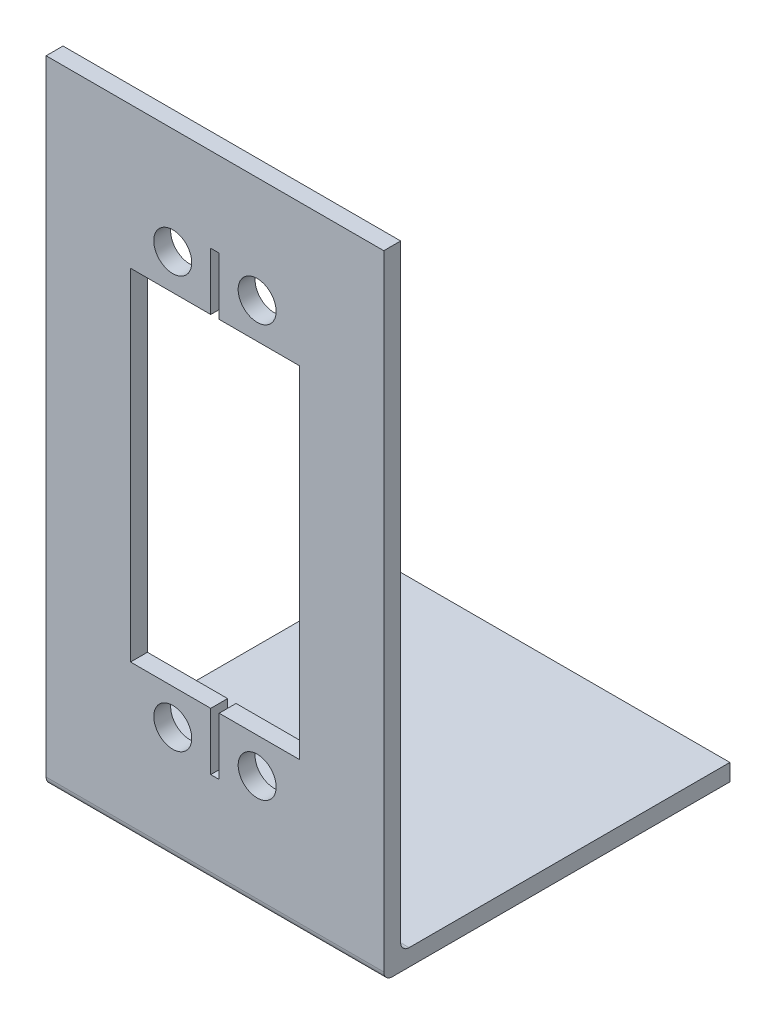
ISO-10303-21;
HEADER;
FILE_DESCRIPTION(('STEP AP214'),'2;1');
FILE_NAME('part.step','',(''),(''),'','','');
FILE_SCHEMA(('AUTOMOTIVE_DESIGN { 1 0 10303 214 1 1 1 1 }'));
ENDSEC;
DATA;
#1=APPLICATION_CONTEXT('core data for automotive mechanical design processes');
#2=APPLICATION_PROTOCOL_DEFINITION('international standard','automotive_design',2000,#1);
#3=PRODUCT_CONTEXT('',#1,'mechanical');
#4=PRODUCT('Part','Part','',(#3));
#5=PRODUCT_RELATED_PRODUCT_CATEGORY('part','',(#4));
#6=PRODUCT_DEFINITION_FORMATION('','',#4);
#7=PRODUCT_DEFINITION_CONTEXT('part definition',#1,'design');
#8=PRODUCT_DEFINITION('design','',#6,#7);
#9=PRODUCT_DEFINITION_SHAPE('','',#8);
#10=(LENGTH_UNIT() NAMED_UNIT(*) SI_UNIT(.MILLI.,.METRE.));
#11=(NAMED_UNIT(*) PLANE_ANGLE_UNIT() SI_UNIT($,.RADIAN.));
#12=(NAMED_UNIT(*) SI_UNIT($,.STERADIAN.) SOLID_ANGLE_UNIT());
#13=UNCERTAINTY_MEASURE_WITH_UNIT(LENGTH_MEASURE(1.E-05),#10,'distance_accuracy_value','');
#14=(GEOMETRIC_REPRESENTATION_CONTEXT(3) GLOBAL_UNCERTAINTY_ASSIGNED_CONTEXT((#13)) GLOBAL_UNIT_ASSIGNED_CONTEXT((#10,
#11,#12)) REPRESENTATION_CONTEXT('',''));
#15=CARTESIAN_POINT('',(0.,0.,0.));
#16=DIRECTION('',(0.,0.,1.));
#17=DIRECTION('',(1.,0.,0.));
#18=AXIS2_PLACEMENT_3D('',#15,#16,#17);
#19=CARTESIAN_POINT('',(0.,0.,-1.));
#20=DIRECTION('',(0.,0.,1.));
#21=DIRECTION('',(1.,0.,0.));
#22=AXIS2_PLACEMENT_3D('',#19,#20,#21);
#23=PLANE('',#22);
#24=CARTESIAN_POINT('',(25.,62.4,-1.));
#25=DIRECTION('',(0.,0.,1.));
#26=DIRECTION('',(1.,0.,0.));
#27=AXIS2_PLACEMENT_3D('',#24,#25,#26);
#28=CIRCLE('',#27,2.25000000000002);
#29=CARTESIAN_POINT('',(27.25,62.4,-1.));
#30=VERTEX_POINT('',#29);
#31=EDGE_CURVE('E441',#30,#30,#28,.T.);
#32=ORIENTED_EDGE('',*,*,#31,.T.);
#33=EDGE_LOOP('',(#32));
#34=FACE_BOUND('',#33,.T.);
#35=CARTESIAN_POINT('',(15.,13.6,-1.));
#36=DIRECTION('',(0.,0.,1.));
#37=DIRECTION('',(1.,0.,0.));
#38=AXIS2_PLACEMENT_3D('',#35,#36,#37);
#39=CIRCLE('',#38,2.25);
#40=CARTESIAN_POINT('',(17.25,13.6,-1.));
#41=VERTEX_POINT('',#40);
#42=EDGE_CURVE('E438',#41,#41,#39,.T.);
#43=ORIENTED_EDGE('',*,*,#42,.T.);
#44=EDGE_LOOP('',(#43));
#45=FACE_BOUND('',#44,.T.);
#46=CARTESIAN_POINT('',(25.,13.6,-1.));
#47=DIRECTION('',(0.,0.,1.));
#48=DIRECTION('',(1.,0.,0.));
#49=AXIS2_PLACEMENT_3D('',#46,#47,#48);
#50=CIRCLE('',#49,2.25);
#51=CARTESIAN_POINT('',(27.25,13.6,-1.));
#52=VERTEX_POINT('',#51);
#53=EDGE_CURVE('E435',#52,#52,#50,.T.);
#54=ORIENTED_EDGE('',*,*,#53,.T.);
#55=EDGE_LOOP('',(#54));
#56=FACE_BOUND('',#55,.T.);
#57=DIRECTION('',(0.,1.,0.));
#58=VECTOR('',#57,1.);
#59=CARTESIAN_POINT('',(40.,0.,-1.));
#60=LINE('',#59,#58);
#61=CARTESIAN_POINT('',(40.,3.,-1.));
#62=VERTEX_POINT('',#61);
#63=CARTESIAN_POINT('',(40.,75.,-1.));
#64=VERTEX_POINT('',#63);
#65=EDGE_CURVE('E457',#62,#64,#60,.T.);
#66=ORIENTED_EDGE('',*,*,#65,.F.);
#67=DIRECTION('',(-1.,0.,0.));
#68=VECTOR('',#67,1.);
#69=CARTESIAN_POINT('',(0.,3.,-1.));
#70=LINE('',#69,#68);
#71=CARTESIAN_POINT('',(0.,3.,-1.));
#72=VERTEX_POINT('',#71);
#73=EDGE_CURVE('E493',#62,#72,#70,.T.);
#74=ORIENTED_EDGE('',*,*,#73,.T.);
#75=DIRECTION('',(0.,1.,0.));
#76=VECTOR('',#75,1.);
#77=CARTESIAN_POINT('',(0.,0.,-1.));
#78=LINE('',#77,#76);
#79=CARTESIAN_POINT('',(0.,75.,-1.));
#80=VERTEX_POINT('',#79);
#81=EDGE_CURVE('E456',#72,#80,#78,.T.);
#82=ORIENTED_EDGE('',*,*,#81,.T.);
#83=DIRECTION('',(1.,0.,0.));
#84=VECTOR('',#83,1.);
#85=CARTESIAN_POINT('',(0.,75.,-1.));
#86=LINE('',#85,#84);
#87=EDGE_CURVE('E444',#80,#64,#86,.T.);
#88=ORIENTED_EDGE('',*,*,#87,.T.);
#89=EDGE_LOOP('',(#66,#74,#82,#88));
#90=FACE_BOUND('',#89,.T.);
#91=CARTESIAN_POINT('',(15.,62.4,-1.));
#92=DIRECTION('',(0.,0.,1.));
#93=DIRECTION('',(1.,0.,0.));
#94=AXIS2_PLACEMENT_3D('',#91,#92,#93);
#95=CIRCLE('',#94,2.25);
#96=CARTESIAN_POINT('',(17.25,62.4,-1.));
#97=VERTEX_POINT('',#96);
#98=EDGE_CURVE('E404',#97,#97,#95,.T.);
#99=ORIENTED_EDGE('',*,*,#98,.T.);
#100=EDGE_LOOP('',(#99));
#101=FACE_BOUND('',#100,.T.);
#102=DIRECTION('',(-1.,0.,0.));
#103=VECTOR('',#102,1.);
#104=CARTESIAN_POINT('',(0.,11.,-1.));
#105=LINE('',#104,#103);
#106=CARTESIAN_POINT('',(20.5,11.,-1.));
#107=VERTEX_POINT('',#106);
#108=CARTESIAN_POINT('',(19.5,11.,-1.));
#109=VERTEX_POINT('',#108);
#110=EDGE_CURVE('E433',#107,#109,#105,.T.);
#111=ORIENTED_EDGE('',*,*,#110,.F.);
#112=DIRECTION('',(0.,-1.,0.));
#113=VECTOR('',#112,1.);
#114=CARTESIAN_POINT('',(20.5,0.,-1.));
#115=LINE('',#114,#113);
#116=CARTESIAN_POINT('',(20.5,17.8,-1.));
#117=VERTEX_POINT('',#116);
#118=EDGE_CURVE('E407',#117,#107,#115,.T.);
#119=ORIENTED_EDGE('',*,*,#118,.F.);
#120=DIRECTION('',(1.,0.,0.));
#121=VECTOR('',#120,1.);
#122=CARTESIAN_POINT('',(0.,17.8,-1.));
#123=LINE('',#122,#121);
#124=CARTESIAN_POINT('',(30.,17.8,-1.));
#125=VERTEX_POINT('',#124);
#126=EDGE_CURVE('E334',#117,#125,#123,.T.);
#127=ORIENTED_EDGE('',*,*,#126,.T.);
#128=DIRECTION('',(0.,-1.,0.));
#129=VECTOR('',#128,1.);
#130=CARTESIAN_POINT('',(30.,0.,-1.));
#131=LINE('',#130,#129);
#132=CARTESIAN_POINT('',(30.,58.2,-1.));
#133=VERTEX_POINT('',#132);
#134=EDGE_CURVE('E410',#133,#125,#131,.T.);
#135=ORIENTED_EDGE('',*,*,#134,.F.);
#136=DIRECTION('',(1.,0.,0.));
#137=VECTOR('',#136,1.);
#138=CARTESIAN_POINT('',(0.,58.2,-1.));
#139=LINE('',#138,#137);
#140=CARTESIAN_POINT('',(20.5,58.2,-1.));
#141=VERTEX_POINT('',#140);
#142=EDGE_CURVE('E412',#141,#133,#139,.T.);
#143=ORIENTED_EDGE('',*,*,#142,.F.);
#144=DIRECTION('',(0.,-1.,0.));
#145=VECTOR('',#144,1.);
#146=CARTESIAN_POINT('',(20.5,0.,-1.));
#147=LINE('',#146,#145);
#148=CARTESIAN_POINT('',(20.5,65.,-1.));
#149=VERTEX_POINT('',#148);
#150=EDGE_CURVE('E414',#149,#141,#147,.T.);
#151=ORIENTED_EDGE('',*,*,#150,.F.);
#152=DIRECTION('',(-1.,0.,0.));
#153=VECTOR('',#152,1.);
#154=CARTESIAN_POINT('',(0.,65.,-1.));
#155=LINE('',#154,#153);
#156=CARTESIAN_POINT('',(19.5,65.,-1.));
#157=VERTEX_POINT('',#156);
#158=EDGE_CURVE('E416',#149,#157,#155,.T.);
#159=ORIENTED_EDGE('',*,*,#158,.T.);
#160=DIRECTION('',(0.,-1.,0.));
#161=VECTOR('',#160,1.);
#162=CARTESIAN_POINT('',(19.5,0.,-1.));
#163=LINE('',#162,#161);
#164=CARTESIAN_POINT('',(19.5,58.2,-1.));
#165=VERTEX_POINT('',#164);
#166=EDGE_CURVE('E419',#157,#165,#163,.T.);
#167=ORIENTED_EDGE('',*,*,#166,.T.);
#168=DIRECTION('',(-1.,0.,0.));
#169=VECTOR('',#168,1.);
#170=CARTESIAN_POINT('',(0.,58.2,-1.));
#171=LINE('',#170,#169);
#172=CARTESIAN_POINT('',(10.,58.2,-1.));
#173=VERTEX_POINT('',#172);
#174=EDGE_CURVE('E422',#165,#173,#171,.T.);
#175=ORIENTED_EDGE('',*,*,#174,.T.);
#176=DIRECTION('',(0.,-1.,0.));
#177=VECTOR('',#176,1.);
#178=CARTESIAN_POINT('',(10.,0.,-1.));
#179=LINE('',#178,#177);
#180=CARTESIAN_POINT('',(10.,17.8,-1.));
#181=VERTEX_POINT('',#180);
#182=EDGE_CURVE('E425',#173,#181,#179,.T.);
#183=ORIENTED_EDGE('',*,*,#182,.T.);
#184=DIRECTION('',(-1.,0.,0.));
#185=VECTOR('',#184,1.);
#186=CARTESIAN_POINT('',(0.,17.8,-1.));
#187=LINE('',#186,#185);
#188=CARTESIAN_POINT('',(19.5,17.8,-1.));
#189=VERTEX_POINT('',#188);
#190=EDGE_CURVE('E428',#189,#181,#187,.T.);
#191=ORIENTED_EDGE('',*,*,#190,.F.);
#192=DIRECTION('',(0.,-1.,0.));
#193=VECTOR('',#192,1.);
#194=CARTESIAN_POINT('',(19.5,0.,-1.));
#195=LINE('',#194,#193);
#196=EDGE_CURVE('E430',#189,#109,#195,.T.);
#197=ORIENTED_EDGE('',*,*,#196,.T.);
#198=EDGE_LOOP('',(#111,#119,#127,#135,#143,#151,#159,#167,#175,#183,#191,#197));
#199=FACE_BOUND('',#198,.T.);
#200=ADVANCED_FACE('F192',(#34,#45,#56,#90,#101,#199),#23,.F.);
#201=CARTESIAN_POINT('',(0.,0.,1.));
#202=DIRECTION('',(0.,0.,1.));
#203=DIRECTION('',(1.,0.,0.));
#204=AXIS2_PLACEMENT_3D('',#201,#202,#203);
#205=PLANE('',#204);
#206=CARTESIAN_POINT('',(25.,62.4,1.));
#207=DIRECTION('',(0.,0.,1.));
#208=DIRECTION('',(1.,0.,0.));
#209=AXIS2_PLACEMENT_3D('',#206,#207,#208);
#210=CIRCLE('',#209,2.25000000000002);
#211=CARTESIAN_POINT('',(27.25,62.4,1.));
#212=VERTEX_POINT('',#211);
#213=EDGE_CURVE('E396',#212,#212,#210,.T.);
#214=ORIENTED_EDGE('',*,*,#213,.F.);
#215=EDGE_LOOP('',(#214));
#216=FACE_BOUND('',#215,.T.);
#217=CARTESIAN_POINT('',(15.,13.6,1.));
#218=DIRECTION('',(0.,0.,1.));
#219=DIRECTION('',(1.,0.,0.));
#220=AXIS2_PLACEMENT_3D('',#217,#218,#219);
#221=CIRCLE('',#220,2.25);
#222=CARTESIAN_POINT('',(17.25,13.6,1.));
#223=VERTEX_POINT('',#222);
#224=EDGE_CURVE('E377',#223,#223,#221,.T.);
#225=ORIENTED_EDGE('',*,*,#224,.F.);
#226=EDGE_LOOP('',(#225));
#227=FACE_BOUND('',#226,.T.);
#228=CARTESIAN_POINT('',(25.,13.6,1.));
#229=DIRECTION('',(0.,0.,1.));
#230=DIRECTION('',(1.,0.,0.));
#231=AXIS2_PLACEMENT_3D('',#228,#229,#230);
#232=CIRCLE('',#231,2.25);
#233=CARTESIAN_POINT('',(27.25,13.6,1.));
#234=VERTEX_POINT('',#233);
#235=EDGE_CURVE('E575',#234,#234,#232,.T.);
#236=ORIENTED_EDGE('',*,*,#235,.F.);
#237=EDGE_LOOP('',(#236));
#238=FACE_BOUND('',#237,.T.);
#239=CARTESIAN_POINT('',(15.,62.4,1.));
#240=DIRECTION('',(0.,0.,1.));
#241=DIRECTION('',(1.,0.,0.));
#242=AXIS2_PLACEMENT_3D('',#239,#240,#241);
#243=CIRCLE('',#242,2.25);
#244=CARTESIAN_POINT('',(17.25,62.4,1.));
#245=VERTEX_POINT('',#244);
#246=EDGE_CURVE('E399',#245,#245,#243,.T.);
#247=ORIENTED_EDGE('',*,*,#246,.F.);
#248=EDGE_LOOP('',(#247));
#249=FACE_BOUND('',#248,.T.);
#250=DIRECTION('',(0.,1.,0.));
#251=VECTOR('',#250,1.);
#252=CARTESIAN_POINT('',(0.,0.,1.));
#253=LINE('',#252,#251);
#254=CARTESIAN_POINT('',(0.,1.,1.));
#255=VERTEX_POINT('',#254);
#256=CARTESIAN_POINT('',(0.,75.,1.));
#257=VERTEX_POINT('',#256);
#258=EDGE_CURVE('E462',#255,#257,#253,.T.);
#259=ORIENTED_EDGE('',*,*,#258,.F.);
#260=DIRECTION('',(1.,0.,0.));
#261=VECTOR('',#260,1.);
#262=CARTESIAN_POINT('',(0.,1.,1.));
#263=LINE('',#262,#261);
#264=CARTESIAN_POINT('',(40.,1.,1.));
#265=VERTEX_POINT('',#264);
#266=EDGE_CURVE('E484',#255,#265,#263,.T.);
#267=ORIENTED_EDGE('',*,*,#266,.T.);
#268=DIRECTION('',(0.,1.,0.));
#269=VECTOR('',#268,1.);
#270=CARTESIAN_POINT('',(40.,0.,1.));
#271=LINE('',#270,#269);
#272=CARTESIAN_POINT('',(40.,75.,1.));
#273=VERTEX_POINT('',#272);
#274=EDGE_CURVE('E460',#265,#273,#271,.T.);
#275=ORIENTED_EDGE('',*,*,#274,.T.);
#276=DIRECTION('',(1.,0.,0.));
#277=VECTOR('',#276,1.);
#278=CARTESIAN_POINT('',(0.,75.,1.));
#279=LINE('',#278,#277);
#280=EDGE_CURVE('E450',#257,#273,#279,.T.);
#281=ORIENTED_EDGE('',*,*,#280,.F.);
#282=EDGE_LOOP('',(#259,#267,#275,#281));
#283=FACE_BOUND('',#282,.T.);
#284=DIRECTION('',(0.,-1.,0.));
#285=VECTOR('',#284,1.);
#286=CARTESIAN_POINT('',(20.5,0.,1.));
#287=LINE('',#286,#285);
#288=CARTESIAN_POINT('',(20.5,17.8,1.));
#289=VERTEX_POINT('',#288);
#290=CARTESIAN_POINT('',(20.5,11.,1.));
#291=VERTEX_POINT('',#290);
#292=EDGE_CURVE('E340',#289,#291,#287,.T.);
#293=ORIENTED_EDGE('',*,*,#292,.T.);
#294=DIRECTION('',(-1.,0.,0.));
#295=VECTOR('',#294,1.);
#296=CARTESIAN_POINT('',(0.,11.,1.));
#297=LINE('',#296,#295);
#298=CARTESIAN_POINT('',(19.5,11.,1.));
#299=VERTEX_POINT('',#298);
#300=EDGE_CURVE('E215',#291,#299,#297,.T.);
#301=ORIENTED_EDGE('',*,*,#300,.T.);
#302=DIRECTION('',(0.,-1.,0.));
#303=VECTOR('',#302,1.);
#304=CARTESIAN_POINT('',(19.5,0.,1.));
#305=LINE('',#304,#303);
#306=CARTESIAN_POINT('',(19.5,17.8,1.));
#307=VERTEX_POINT('',#306);
#308=EDGE_CURVE('E372',#307,#299,#305,.T.);
#309=ORIENTED_EDGE('',*,*,#308,.F.);
#310=DIRECTION('',(-1.,0.,0.));
#311=VECTOR('',#310,1.);
#312=CARTESIAN_POINT('',(0.,17.8,1.));
#313=LINE('',#312,#311);
#314=CARTESIAN_POINT('',(10.,17.8,1.));
#315=VERTEX_POINT('',#314);
#316=EDGE_CURVE('E369',#307,#315,#313,.T.);
#317=ORIENTED_EDGE('',*,*,#316,.T.);
#318=DIRECTION('',(0.,-1.,0.));
#319=VECTOR('',#318,1.);
#320=CARTESIAN_POINT('',(10.,0.,1.));
#321=LINE('',#320,#319);
#322=CARTESIAN_POINT('',(10.,58.2,1.));
#323=VERTEX_POINT('',#322);
#324=EDGE_CURVE('E366',#323,#315,#321,.T.);
#325=ORIENTED_EDGE('',*,*,#324,.F.);
#326=DIRECTION('',(-1.,0.,0.));
#327=VECTOR('',#326,1.);
#328=CARTESIAN_POINT('',(0.,58.2,1.));
#329=LINE('',#328,#327);
#330=CARTESIAN_POINT('',(19.5,58.2,1.));
#331=VERTEX_POINT('',#330);
#332=EDGE_CURVE('E363',#331,#323,#329,.T.);
#333=ORIENTED_EDGE('',*,*,#332,.F.);
#334=DIRECTION('',(0.,-1.,0.));
#335=VECTOR('',#334,1.);
#336=CARTESIAN_POINT('',(19.5,0.,1.));
#337=LINE('',#336,#335);
#338=CARTESIAN_POINT('',(19.5,65.,1.));
#339=VERTEX_POINT('',#338);
#340=EDGE_CURVE('E360',#339,#331,#337,.T.);
#341=ORIENTED_EDGE('',*,*,#340,.F.);
#342=DIRECTION('',(-1.,0.,0.));
#343=VECTOR('',#342,1.);
#344=CARTESIAN_POINT('',(0.,65.,1.));
#345=LINE('',#344,#343);
#346=CARTESIAN_POINT('',(20.5,65.,1.));
#347=VERTEX_POINT('',#346);
#348=EDGE_CURVE('E357',#347,#339,#345,.T.);
#349=ORIENTED_EDGE('',*,*,#348,.F.);
#350=DIRECTION('',(0.,-1.,0.));
#351=VECTOR('',#350,1.);
#352=CARTESIAN_POINT('',(20.5,0.,1.));
#353=LINE('',#352,#351);
#354=CARTESIAN_POINT('',(20.5,58.2,1.));
#355=VERTEX_POINT('',#354);
#356=EDGE_CURVE('E354',#347,#355,#353,.T.);
#357=ORIENTED_EDGE('',*,*,#356,.T.);
#358=DIRECTION('',(1.,0.,0.));
#359=VECTOR('',#358,1.);
#360=CARTESIAN_POINT('',(0.,58.2,1.));
#361=LINE('',#360,#359);
#362=CARTESIAN_POINT('',(30.,58.2,1.));
#363=VERTEX_POINT('',#362);
#364=EDGE_CURVE('E349',#355,#363,#361,.T.);
#365=ORIENTED_EDGE('',*,*,#364,.T.);
#366=DIRECTION('',(0.,-1.,0.));
#367=VECTOR('',#366,1.);
#368=CARTESIAN_POINT('',(30.,0.,1.));
#369=LINE('',#368,#367);
#370=CARTESIAN_POINT('',(30.,17.8,1.));
#371=VERTEX_POINT('',#370);
#372=EDGE_CURVE('E347',#363,#371,#369,.T.);
#373=ORIENTED_EDGE('',*,*,#372,.T.);
#374=DIRECTION('',(1.,0.,0.));
#375=VECTOR('',#374,1.);
#376=CARTESIAN_POINT('',(0.,17.8,1.));
#377=LINE('',#376,#375);
#378=EDGE_CURVE('E331',#289,#371,#377,.T.);
#379=ORIENTED_EDGE('',*,*,#378,.F.);
#380=EDGE_LOOP('',(#293,#301,#309,#317,#325,#333,#341,#349,#357,#365,#373,#379));
#381=FACE_BOUND('',#380,.T.);
#382=ADVANCED_FACE('F344',(#216,#227,#238,#249,#283,#381),#205,.T.);
#383=CARTESIAN_POINT('',(0.,2.,0.));
#384=DIRECTION('',(0.,-1.,0.));
#385=DIRECTION('',(0.,0.,-1.));
#386=AXIS2_PLACEMENT_3D('',#383,#384,#385);
#387=PLANE('',#386);
#388=CARTESIAN_POINT('',(20.,2.,-15.));
#389=DIRECTION('',(0.,1.,0.));
#390=DIRECTION('',(0.,0.,1.));
#391=AXIS2_PLACEMENT_3D('',#388,#389,#390);
#392=CIRCLE('',#391,1.525);
#393=CARTESIAN_POINT('',(20.,2.,-13.475));
#394=VERTEX_POINT('',#393);
#395=EDGE_CURVE('E565',#394,#394,#392,.T.);
#396=ORIENTED_EDGE('',*,*,#395,.F.);
#397=EDGE_LOOP('',(#396));
#398=FACE_BOUND('',#397,.T.);
#399=DIRECTION('',(0.,0.,1.));
#400=VECTOR('',#399,1.);
#401=CARTESIAN_POINT('',(0.,2.,0.));
#402=LINE('',#401,#400);
#403=CARTESIAN_POINT('',(0.,2.,-40.));
#404=VERTEX_POINT('',#403);
#405=CARTESIAN_POINT('',(0.,2.,-2.));
#406=VERTEX_POINT('',#405);
#407=EDGE_CURVE('E465',#404,#406,#402,.T.);
#408=ORIENTED_EDGE('',*,*,#407,.T.);
#409=DIRECTION('',(-1.,0.,0.));
#410=VECTOR('',#409,1.);
#411=CARTESIAN_POINT('',(40.,2.,-2.));
#412=LINE('',#411,#410);
#413=CARTESIAN_POINT('',(40.,2.,-2.));
#414=VERTEX_POINT('',#413);
#415=EDGE_CURVE('E496',#406,#414,#412,.F.);
#416=ORIENTED_EDGE('',*,*,#415,.T.);
#417=DIRECTION('',(0.,0.,-1.));
#418=VECTOR('',#417,1.);
#419=CARTESIAN_POINT('',(40.,2.,0.));
#420=LINE('',#419,#418);
#421=CARTESIAN_POINT('',(40.,2.,-40.));
#422=VERTEX_POINT('',#421);
#423=EDGE_CURVE('E468',#414,#422,#420,.T.);
#424=ORIENTED_EDGE('',*,*,#423,.T.);
#425=DIRECTION('',(-1.,0.,0.));
#426=VECTOR('',#425,1.);
#427=CARTESIAN_POINT('',(0.,2.,-40.));
#428=LINE('',#427,#426);
#429=EDGE_CURVE('E471',#422,#404,#428,.T.);
#430=ORIENTED_EDGE('',*,*,#429,.T.);
#431=EDGE_LOOP('',(#408,#416,#424,#430));
#432=FACE_BOUND('',#431,.T.);
#433=ADVANCED_FACE('F506',(#398,#432),#387,.F.);
#434=CARTESIAN_POINT('',(0.,2.,0.));
#435=DIRECTION('',(1.,0.,0.));
#436=DIRECTION('',(0.,0.,-1.));
#437=AXIS2_PLACEMENT_3D('',#434,#435,#436);
#438=PLANE('',#437);
#439=DIRECTION('',(0.,0.,1.));
#440=VECTOR('',#439,1.);
#441=CARTESIAN_POINT('',(0.,0.,0.));
#442=LINE('',#441,#440);
#443=CARTESIAN_POINT('',(0.,0.,-40.));
#444=VERTEX_POINT('',#443);
#445=CARTESIAN_POINT('',(0.,0.,0.));
#446=VERTEX_POINT('',#445);
#447=EDGE_CURVE('E459',#444,#446,#442,.T.);
#448=ORIENTED_EDGE('',*,*,#447,.T.);
#449=CARTESIAN_POINT('',(0.,1.,0.));
#450=DIRECTION('',(1.,0.,0.));
#451=DIRECTION('',(0.,0.,-1.));
#452=AXIS2_PLACEMENT_3D('',#449,#450,#451);
#453=CIRCLE('',#452,1.);
#454=EDGE_CURVE('E491',#446,#255,#453,.F.);
#455=ORIENTED_EDGE('',*,*,#454,.T.);
#456=ORIENTED_EDGE('',*,*,#258,.T.);
#457=DIRECTION('',(0.,0.,1.));
#458=VECTOR('',#457,1.);
#459=CARTESIAN_POINT('',(0.,75.,0.));
#460=LINE('',#459,#458);
#461=EDGE_CURVE('E447',#80,#257,#460,.T.);
#462=ORIENTED_EDGE('',*,*,#461,.F.);
#463=ORIENTED_EDGE('',*,*,#81,.F.);
#464=CARTESIAN_POINT('',(0.,3.,-2.));
#465=DIRECTION('',(1.,0.,0.));
#466=DIRECTION('',(0.,0.,-1.));
#467=AXIS2_PLACEMENT_3D('',#464,#465,#466);
#468=CIRCLE('',#467,1.);
#469=EDGE_CURVE('E200',#72,#406,#468,.T.);
#470=ORIENTED_EDGE('',*,*,#469,.T.);
#471=ORIENTED_EDGE('',*,*,#407,.F.);
#472=DIRECTION('',(0.,-1.,0.));
#473=VECTOR('',#472,1.);
#474=CARTESIAN_POINT('',(0.,2.,-40.));
#475=LINE('',#474,#473);
#476=EDGE_CURVE('E473',#404,#444,#475,.T.);
#477=ORIENTED_EDGE('',*,*,#476,.T.);
#478=EDGE_LOOP('',(#448,#455,#456,#462,#463,#470,#471,#477));
#479=FACE_BOUND('',#478,.T.);
#480=ADVANCED_FACE('F500',(#479),#438,.F.);
#481=CARTESIAN_POINT('',(40.,2.,0.));
#482=DIRECTION('',(-1.,0.,0.));
#483=DIRECTION('',(0.,0.,1.));
#484=AXIS2_PLACEMENT_3D('',#481,#482,#483);
#485=PLANE('',#484);
#486=ORIENTED_EDGE('',*,*,#274,.F.);
#487=CARTESIAN_POINT('',(40.,1.,0.));
#488=DIRECTION('',(-1.,0.,0.));
#489=DIRECTION('',(0.,0.,1.));
#490=AXIS2_PLACEMENT_3D('',#487,#488,#489);
#491=CIRCLE('',#490,1.);
#492=CARTESIAN_POINT('',(40.,0.,0.));
#493=VERTEX_POINT('',#492);
#494=EDGE_CURVE('E487',#265,#493,#491,.F.);
#495=ORIENTED_EDGE('',*,*,#494,.T.);
#496=DIRECTION('',(0.,0.,-1.));
#497=VECTOR('',#496,1.);
#498=CARTESIAN_POINT('',(40.,0.,0.));
#499=LINE('',#498,#497);
#500=CARTESIAN_POINT('',(40.,0.,-40.));
#501=VERTEX_POINT('',#500);
#502=EDGE_CURVE('E476',#493,#501,#499,.T.);
#503=ORIENTED_EDGE('',*,*,#502,.T.);
#504=DIRECTION('',(0.,-1.,0.));
#505=VECTOR('',#504,1.);
#506=CARTESIAN_POINT('',(40.,2.,-40.));
#507=LINE('',#506,#505);
#508=EDGE_CURVE('E481',#422,#501,#507,.T.);
#509=ORIENTED_EDGE('',*,*,#508,.F.);
#510=ORIENTED_EDGE('',*,*,#423,.F.);
#511=CARTESIAN_POINT('',(40.,3.,-2.));
#512=DIRECTION('',(-1.,0.,0.));
#513=DIRECTION('',(0.,0.,1.));
#514=AXIS2_PLACEMENT_3D('',#511,#512,#513);
#515=CIRCLE('',#514,1.);
#516=EDGE_CURVE('E12',#414,#62,#515,.T.);
#517=ORIENTED_EDGE('',*,*,#516,.T.);
#518=ORIENTED_EDGE('',*,*,#65,.T.);
#519=DIRECTION('',(0.,0.,-1.));
#520=VECTOR('',#519,1.);
#521=CARTESIAN_POINT('',(40.,75.,0.));
#522=LINE('',#521,#520);
#523=EDGE_CURVE('E453',#273,#64,#522,.T.);
#524=ORIENTED_EDGE('',*,*,#523,.F.);
#525=EDGE_LOOP('',(#486,#495,#503,#509,#510,#517,#518,#524));
#526=FACE_BOUND('',#525,.T.);
#527=ADVANCED_FACE('F514',(#526),#485,.F.);
#528=CARTESIAN_POINT('',(0.,2.,-40.));
#529=DIRECTION('',(0.,0.,1.));
#530=DIRECTION('',(1.,0.,0.));
#531=AXIS2_PLACEMENT_3D('',#528,#529,#530);
#532=PLANE('',#531);
#533=DIRECTION('',(-1.,0.,0.));
#534=VECTOR('',#533,1.);
#535=CARTESIAN_POINT('',(0.,0.,-40.));
#536=LINE('',#535,#534);
#537=EDGE_CURVE('E469',#501,#444,#536,.T.);
#538=ORIENTED_EDGE('',*,*,#537,.T.);
#539=ORIENTED_EDGE('',*,*,#476,.F.);
#540=ORIENTED_EDGE('',*,*,#429,.F.);
#541=ORIENTED_EDGE('',*,*,#508,.T.);
#542=EDGE_LOOP('',(#538,#539,#540,#541));
#543=FACE_BOUND('',#542,.T.);
#544=ADVANCED_FACE('F536',(#543),#532,.F.);
#545=CARTESIAN_POINT('',(0.,0.,0.));
#546=DIRECTION('',(0.,-1.,0.));
#547=DIRECTION('',(0.,0.,-1.));
#548=AXIS2_PLACEMENT_3D('',#545,#546,#547);
#549=PLANE('',#548);
#550=CARTESIAN_POINT('',(20.,0.,-15.));
#551=DIRECTION('',(0.,1.,0.));
#552=DIRECTION('',(0.,0.,1.));
#553=AXIS2_PLACEMENT_3D('',#550,#551,#552);
#554=CIRCLE('',#553,1.25);
#555=CARTESIAN_POINT('',(20.,0.,-13.75));
#556=VERTEX_POINT('',#555);
#557=EDGE_CURVE('E570',#556,#556,#554,.T.);
#558=ORIENTED_EDGE('',*,*,#557,.T.);
#559=EDGE_LOOP('',(#558));
#560=FACE_BOUND('',#559,.T.);
#561=ORIENTED_EDGE('',*,*,#502,.F.);
#562=DIRECTION('',(1.,0.,0.));
#563=VECTOR('',#562,1.);
#564=CARTESIAN_POINT('',(0.,0.,0.));
#565=LINE('',#564,#563);
#566=EDGE_CURVE('E489',#493,#446,#565,.F.);
#567=ORIENTED_EDGE('',*,*,#566,.T.);
#568=ORIENTED_EDGE('',*,*,#447,.F.);
#569=ORIENTED_EDGE('',*,*,#537,.F.);
#570=EDGE_LOOP('',(#561,#567,#568,#569));
#571=FACE_BOUND('',#570,.T.);
#572=ADVANCED_FACE('F533',(#560,#571),#549,.T.);
#573=CARTESIAN_POINT('',(0.,75.,0.));
#574=DIRECTION('',(0.,1.,0.));
#575=DIRECTION('',(0.,0.,1.));
#576=AXIS2_PLACEMENT_3D('',#573,#574,#575);
#577=PLANE('',#576);
#578=ORIENTED_EDGE('',*,*,#87,.F.);
#579=ORIENTED_EDGE('',*,*,#461,.T.);
#580=ORIENTED_EDGE('',*,*,#280,.T.);
#581=ORIENTED_EDGE('',*,*,#523,.T.);
#582=EDGE_LOOP('',(#578,#579,#580,#581));
#583=FACE_BOUND('',#582,.T.);
#584=ADVANCED_FACE('F521',(#583),#577,.T.);
#585=CARTESIAN_POINT('',(0.,1.,0.));
#586=DIRECTION('',(1.,0.,0.));
#587=DIRECTION('',(0.,0.,-1.));
#588=AXIS2_PLACEMENT_3D('',#585,#586,#587);
#589=CYLINDRICAL_SURFACE('',#588,1.);
#590=ORIENTED_EDGE('',*,*,#454,.F.);
#591=ORIENTED_EDGE('',*,*,#566,.F.);
#592=ORIENTED_EDGE('',*,*,#494,.F.);
#593=ORIENTED_EDGE('',*,*,#266,.F.);
#594=EDGE_LOOP('',(#590,#591,#592,#593));
#595=FACE_BOUND('',#594,.T.);
#596=ADVANCED_FACE('F529',(#595),#589,.T.);
#597=CARTESIAN_POINT('',(0.,3.,-2.));
#598=DIRECTION('',(1.,0.,0.));
#599=DIRECTION('',(0.,0.,-1.));
#600=AXIS2_PLACEMENT_3D('',#597,#598,#599);
#601=CYLINDRICAL_SURFACE('',#600,1.);
#602=ORIENTED_EDGE('',*,*,#516,.F.);
#603=ORIENTED_EDGE('',*,*,#415,.F.);
#604=ORIENTED_EDGE('',*,*,#469,.F.);
#605=ORIENTED_EDGE('',*,*,#73,.F.);
#606=EDGE_LOOP('',(#602,#603,#604,#605));
#607=FACE_BOUND('',#606,.T.);
#608=ADVANCED_FACE('F194',(#607),#601,.F.);
#609=CARTESIAN_POINT('',(15.,62.4,-48.));
#610=DIRECTION('',(0.,0.,1.));
#611=DIRECTION('',(1.,0.,0.));
#612=AXIS2_PLACEMENT_3D('',#609,#610,#611);
#613=CYLINDRICAL_SURFACE('',#612,2.25);
#614=ORIENTED_EDGE('',*,*,#246,.T.);
#615=EDGE_LOOP('',(#614));
#616=FACE_BOUND('',#615,.T.);
#617=ORIENTED_EDGE('',*,*,#98,.F.);
#618=EDGE_LOOP('',(#617));
#619=FACE_BOUND('',#618,.T.);
#620=ADVANCED_FACE('F620',(#616,#619),#613,.F.);
#621=CARTESIAN_POINT('',(0.,11.,-48.));
#622=DIRECTION('',(0.,1.,0.));
#623=DIRECTION('',(0.,0.,1.));
#624=AXIS2_PLACEMENT_3D('',#621,#622,#623);
#625=PLANE('',#624);
#626=ORIENTED_EDGE('',*,*,#110,.T.);
#627=DIRECTION('',(0.,0.,1.));
#628=VECTOR('',#627,1.);
#629=CARTESIAN_POINT('',(19.5,11.,-48.));
#630=LINE('',#629,#628);
#631=EDGE_CURVE('E375',#109,#299,#630,.T.);
#632=ORIENTED_EDGE('',*,*,#631,.T.);
#633=ORIENTED_EDGE('',*,*,#300,.F.);
#634=DIRECTION('',(0.,0.,1.));
#635=VECTOR('',#634,1.);
#636=CARTESIAN_POINT('',(20.5,11.,-48.));
#637=LINE('',#636,#635);
#638=EDGE_CURVE('E337',#107,#291,#637,.T.);
#639=ORIENTED_EDGE('',*,*,#638,.F.);
#640=EDGE_LOOP('',(#626,#632,#633,#639));
#641=FACE_BOUND('',#640,.T.);
#642=ADVANCED_FACE('F618',(#641),#625,.T.);
#643=CARTESIAN_POINT('',(19.5,0.,-48.));
#644=DIRECTION('',(-1.,0.,0.));
#645=DIRECTION('',(0.,-1.,0.));
#646=AXIS2_PLACEMENT_3D('',#643,#644,#645);
#647=PLANE('',#646);
#648=DIRECTION('',(0.,0.,1.));
#649=VECTOR('',#648,1.);
#650=CARTESIAN_POINT('',(19.5,17.8,-48.));
#651=LINE('',#650,#649);
#652=EDGE_CURVE('E378',#189,#307,#651,.T.);
#653=ORIENTED_EDGE('',*,*,#652,.T.);
#654=ORIENTED_EDGE('',*,*,#308,.T.);
#655=ORIENTED_EDGE('',*,*,#631,.F.);
#656=ORIENTED_EDGE('',*,*,#196,.F.);
#657=EDGE_LOOP('',(#653,#654,#655,#656));
#658=FACE_BOUND('',#657,.T.);
#659=ADVANCED_FACE('F582',(#658),#647,.F.);
#660=CARTESIAN_POINT('',(0.,17.8,-48.));
#661=DIRECTION('',(0.,1.,0.));
#662=DIRECTION('',(0.,0.,1.));
#663=AXIS2_PLACEMENT_3D('',#660,#661,#662);
#664=PLANE('',#663);
#665=ORIENTED_EDGE('',*,*,#190,.T.);
#666=DIRECTION('',(0.,0.,1.));
#667=VECTOR('',#666,1.);
#668=CARTESIAN_POINT('',(10.,17.8,-48.));
#669=LINE('',#668,#667);
#670=EDGE_CURVE('E380',#181,#315,#669,.T.);
#671=ORIENTED_EDGE('',*,*,#670,.T.);
#672=ORIENTED_EDGE('',*,*,#316,.F.);
#673=ORIENTED_EDGE('',*,*,#652,.F.);
#674=EDGE_LOOP('',(#665,#671,#672,#673));
#675=FACE_BOUND('',#674,.T.);
#676=ADVANCED_FACE('F586',(#675),#664,.T.);
#677=CARTESIAN_POINT('',(10.,0.,-48.));
#678=DIRECTION('',(-1.,0.,0.));
#679=DIRECTION('',(0.,-1.,0.));
#680=AXIS2_PLACEMENT_3D('',#677,#678,#679);
#681=PLANE('',#680);
#682=DIRECTION('',(0.,0.,1.));
#683=VECTOR('',#682,1.);
#684=CARTESIAN_POINT('',(10.,58.2,-48.));
#685=LINE('',#684,#683);
#686=EDGE_CURVE('E382',#173,#323,#685,.T.);
#687=ORIENTED_EDGE('',*,*,#686,.T.);
#688=ORIENTED_EDGE('',*,*,#324,.T.);
#689=ORIENTED_EDGE('',*,*,#670,.F.);
#690=ORIENTED_EDGE('',*,*,#182,.F.);
#691=EDGE_LOOP('',(#687,#688,#689,#690));
#692=FACE_BOUND('',#691,.T.);
#693=ADVANCED_FACE('F589',(#692),#681,.F.);
#694=CARTESIAN_POINT('',(0.,58.2,-48.));
#695=DIRECTION('',(0.,1.,0.));
#696=DIRECTION('',(0.,0.,1.));
#697=AXIS2_PLACEMENT_3D('',#694,#695,#696);
#698=PLANE('',#697);
#699=DIRECTION('',(0.,0.,1.));
#700=VECTOR('',#699,1.);
#701=CARTESIAN_POINT('',(19.5,58.2,-48.));
#702=LINE('',#701,#700);
#703=EDGE_CURVE('E384',#165,#331,#702,.T.);
#704=ORIENTED_EDGE('',*,*,#703,.T.);
#705=ORIENTED_EDGE('',*,*,#332,.T.);
#706=ORIENTED_EDGE('',*,*,#686,.F.);
#707=ORIENTED_EDGE('',*,*,#174,.F.);
#708=EDGE_LOOP('',(#704,#705,#706,#707));
#709=FACE_BOUND('',#708,.T.);
#710=ADVANCED_FACE('F595',(#709),#698,.F.);
#711=CARTESIAN_POINT('',(19.5,0.,-48.));
#712=DIRECTION('',(-1.,0.,0.));
#713=DIRECTION('',(0.,0.,1.));
#714=AXIS2_PLACEMENT_3D('',#711,#712,#713);
#715=PLANE('',#714);
#716=DIRECTION('',(0.,0.,1.));
#717=VECTOR('',#716,1.);
#718=CARTESIAN_POINT('',(19.5,65.,-48.));
#719=LINE('',#718,#717);
#720=EDGE_CURVE('E386',#157,#339,#719,.T.);
#721=ORIENTED_EDGE('',*,*,#720,.T.);
#722=ORIENTED_EDGE('',*,*,#340,.T.);
#723=ORIENTED_EDGE('',*,*,#703,.F.);
#724=ORIENTED_EDGE('',*,*,#166,.F.);
#725=EDGE_LOOP('',(#721,#722,#723,#724));
#726=FACE_BOUND('',#725,.T.);
#727=ADVANCED_FACE('F598',(#726),#715,.F.);
#728=CARTESIAN_POINT('',(0.,65.,-48.));
#729=DIRECTION('',(0.,1.,0.));
#730=DIRECTION('',(0.,0.,1.));
#731=AXIS2_PLACEMENT_3D('',#728,#729,#730);
#732=PLANE('',#731);
#733=DIRECTION('',(0.,0.,1.));
#734=VECTOR('',#733,1.);
#735=CARTESIAN_POINT('',(20.5,65.,-48.));
#736=LINE('',#735,#734);
#737=EDGE_CURVE('E388',#149,#347,#736,.T.);
#738=ORIENTED_EDGE('',*,*,#737,.T.);
#739=ORIENTED_EDGE('',*,*,#348,.T.);
#740=ORIENTED_EDGE('',*,*,#720,.F.);
#741=ORIENTED_EDGE('',*,*,#158,.F.);
#742=EDGE_LOOP('',(#738,#739,#740,#741));
#743=FACE_BOUND('',#742,.T.);
#744=ADVANCED_FACE('F601',(#743),#732,.F.);
#745=CARTESIAN_POINT('',(20.5,0.,-48.));
#746=DIRECTION('',(-1.,0.,0.));
#747=DIRECTION('',(0.,0.,1.));
#748=AXIS2_PLACEMENT_3D('',#745,#746,#747);
#749=PLANE('',#748);
#750=ORIENTED_EDGE('',*,*,#150,.T.);
#751=DIRECTION('',(0.,0.,1.));
#752=VECTOR('',#751,1.);
#753=CARTESIAN_POINT('',(20.5,58.2,-48.));
#754=LINE('',#753,#752);
#755=EDGE_CURVE('E390',#141,#355,#754,.T.);
#756=ORIENTED_EDGE('',*,*,#755,.T.);
#757=ORIENTED_EDGE('',*,*,#356,.F.);
#758=ORIENTED_EDGE('',*,*,#737,.F.);
#759=EDGE_LOOP('',(#750,#756,#757,#758));
#760=FACE_BOUND('',#759,.T.);
#761=ADVANCED_FACE('F606',(#760),#749,.T.);
#762=CARTESIAN_POINT('',(0.,58.2,-48.));
#763=DIRECTION('',(0.,-1.,0.));
#764=DIRECTION('',(0.,0.,-1.));
#765=AXIS2_PLACEMENT_3D('',#762,#763,#764);
#766=PLANE('',#765);
#767=ORIENTED_EDGE('',*,*,#142,.T.);
#768=DIRECTION('',(0.,0.,1.));
#769=VECTOR('',#768,1.);
#770=CARTESIAN_POINT('',(30.,58.2,-48.));
#771=LINE('',#770,#769);
#772=EDGE_CURVE('E392',#133,#363,#771,.T.);
#773=ORIENTED_EDGE('',*,*,#772,.T.);
#774=ORIENTED_EDGE('',*,*,#364,.F.);
#775=ORIENTED_EDGE('',*,*,#755,.F.);
#776=EDGE_LOOP('',(#767,#773,#774,#775));
#777=FACE_BOUND('',#776,.T.);
#778=ADVANCED_FACE('F611',(#777),#766,.T.);
#779=CARTESIAN_POINT('',(30.,0.,-48.));
#780=DIRECTION('',(-1.,0.,0.));
#781=DIRECTION('',(0.,0.,1.));
#782=AXIS2_PLACEMENT_3D('',#779,#780,#781);
#783=PLANE('',#782);
#784=ORIENTED_EDGE('',*,*,#134,.T.);
#785=DIRECTION('',(0.,0.,1.));
#786=VECTOR('',#785,1.);
#787=CARTESIAN_POINT('',(30.,17.8,-48.));
#788=LINE('',#787,#786);
#789=EDGE_CURVE('E336',#125,#371,#788,.T.);
#790=ORIENTED_EDGE('',*,*,#789,.T.);
#791=ORIENTED_EDGE('',*,*,#372,.F.);
#792=ORIENTED_EDGE('',*,*,#772,.F.);
#793=EDGE_LOOP('',(#784,#790,#791,#792));
#794=FACE_BOUND('',#793,.T.);
#795=ADVANCED_FACE('F615',(#794),#783,.T.);
#796=CARTESIAN_POINT('',(0.,17.8,-48.));
#797=DIRECTION('',(0.,-1.,0.));
#798=DIRECTION('',(0.,0.,-1.));
#799=AXIS2_PLACEMENT_3D('',#796,#797,#798);
#800=PLANE('',#799);
#801=DIRECTION('',(0.,0.,1.));
#802=VECTOR('',#801,1.);
#803=CARTESIAN_POINT('',(20.5,17.8,-48.));
#804=LINE('',#803,#802);
#805=EDGE_CURVE('E207',#117,#289,#804,.T.);
#806=ORIENTED_EDGE('',*,*,#805,.T.);
#807=ORIENTED_EDGE('',*,*,#378,.T.);
#808=ORIENTED_EDGE('',*,*,#789,.F.);
#809=ORIENTED_EDGE('',*,*,#126,.F.);
#810=EDGE_LOOP('',(#806,#807,#808,#809));
#811=FACE_BOUND('',#810,.T.);
#812=ADVANCED_FACE('F328',(#811),#800,.F.);
#813=CARTESIAN_POINT('',(20.5,0.,-48.));
#814=DIRECTION('',(-1.,0.,0.));
#815=DIRECTION('',(0.,0.,1.));
#816=AXIS2_PLACEMENT_3D('',#813,#814,#815);
#817=PLANE('',#816);
#818=ORIENTED_EDGE('',*,*,#118,.T.);
#819=ORIENTED_EDGE('',*,*,#638,.T.);
#820=ORIENTED_EDGE('',*,*,#292,.F.);
#821=ORIENTED_EDGE('',*,*,#805,.F.);
#822=EDGE_LOOP('',(#818,#819,#820,#821));
#823=FACE_BOUND('',#822,.T.);
#824=ADVANCED_FACE('F341',(#823),#817,.T.);
#825=CARTESIAN_POINT('',(25.,13.6,-48.));
#826=DIRECTION('',(0.,0.,1.));
#827=DIRECTION('',(1.,0.,0.));
#828=AXIS2_PLACEMENT_3D('',#825,#826,#827);
#829=CYLINDRICAL_SURFACE('',#828,2.25);
#830=ORIENTED_EDGE('',*,*,#235,.T.);
#831=EDGE_LOOP('',(#830));
#832=FACE_BOUND('',#831,.T.);
#833=ORIENTED_EDGE('',*,*,#53,.F.);
#834=EDGE_LOOP('',(#833));
#835=FACE_BOUND('',#834,.T.);
#836=ADVANCED_FACE('F639',(#832,#835),#829,.F.);
#837=CARTESIAN_POINT('',(15.,13.6,-48.));
#838=DIRECTION('',(0.,0.,1.));
#839=DIRECTION('',(1.,0.,0.));
#840=AXIS2_PLACEMENT_3D('',#837,#838,#839);
#841=CYLINDRICAL_SURFACE('',#840,2.25);
#842=ORIENTED_EDGE('',*,*,#224,.T.);
#843=EDGE_LOOP('',(#842));
#844=FACE_BOUND('',#843,.T.);
#845=ORIENTED_EDGE('',*,*,#42,.F.);
#846=EDGE_LOOP('',(#845));
#847=FACE_BOUND('',#846,.T.);
#848=ADVANCED_FACE('F636',(#844,#847),#841,.F.);
#849=CARTESIAN_POINT('',(25.,62.4,-48.));
#850=DIRECTION('',(0.,0.,1.));
#851=DIRECTION('',(1.,0.,0.));
#852=AXIS2_PLACEMENT_3D('',#849,#850,#851);
#853=CYLINDRICAL_SURFACE('',#852,2.25000000000002);
#854=ORIENTED_EDGE('',*,*,#213,.T.);
#855=EDGE_LOOP('',(#854));
#856=FACE_BOUND('',#855,.T.);
#857=ORIENTED_EDGE('',*,*,#31,.F.);
#858=EDGE_LOOP('',(#857));
#859=FACE_BOUND('',#858,.T.);
#860=ADVANCED_FACE('F632',(#856,#859),#853,.F.);
#861=CARTESIAN_POINT('',(20.,2.,-15.));
#862=DIRECTION('',(0.,1.,0.));
#863=DIRECTION('',(0.,0.,1.));
#864=AXIS2_PLACEMENT_3D('',#861,#862,#863);
#865=CYLINDRICAL_SURFACE('',#864,1.25);
#866=ORIENTED_EDGE('',*,*,#557,.F.);
#867=EDGE_LOOP('',(#866));
#868=FACE_BOUND('',#867,.T.);
#869=CARTESIAN_POINT('',(20.,1.725,-15.));
#870=DIRECTION('',(0.,1.,0.));
#871=DIRECTION('',(0.,0.,1.));
#872=AXIS2_PLACEMENT_3D('',#869,#870,#871);
#873=CIRCLE('',#872,1.25);
#874=CARTESIAN_POINT('',(20.,1.725,-13.75));
#875=VERTEX_POINT('',#874);
#876=EDGE_CURVE('E567',#875,#875,#873,.T.);
#877=ORIENTED_EDGE('',*,*,#876,.T.);
#878=EDGE_LOOP('',(#877));
#879=FACE_BOUND('',#878,.T.);
#880=ADVANCED_FACE('F635',(#868,#879),#865,.F.);
#881=CARTESIAN_POINT('',(20.,2.,-15.));
#882=DIRECTION('',(0.,1.,0.));
#883=DIRECTION('',(0.,0.,1.));
#884=AXIS2_PLACEMENT_3D('',#881,#882,#883);
#885=CONICAL_SURFACE('',#884,1.525,0.785398163397455);
#886=ORIENTED_EDGE('',*,*,#876,.F.);
#887=EDGE_LOOP('',(#886));
#888=FACE_BOUND('',#887,.T.);
#889=ORIENTED_EDGE('',*,*,#395,.T.);
#890=EDGE_LOOP('',(#889));
#891=FACE_BOUND('',#890,.T.);
#892=ADVANCED_FACE('F797',(#888,#891),#885,.F.);
#893=CLOSED_SHELL('',(#200,#382,#433,#480,#527,#544,#572,#584,#596,#608,#620,#642,#659,#676,
#693,#710,#727,#744,#761,#778,#795,#812,#824,#836,#848,#860,#880,#892));
#894=MANIFOLD_SOLID_BREP('B2',#893);
#895=ADVANCED_BREP_SHAPE_REPRESENTATION('',(#18,#894),#14);
#896=SHAPE_DEFINITION_REPRESENTATION(#9,#895);
ENDSEC;
END-ISO-10303-21;
